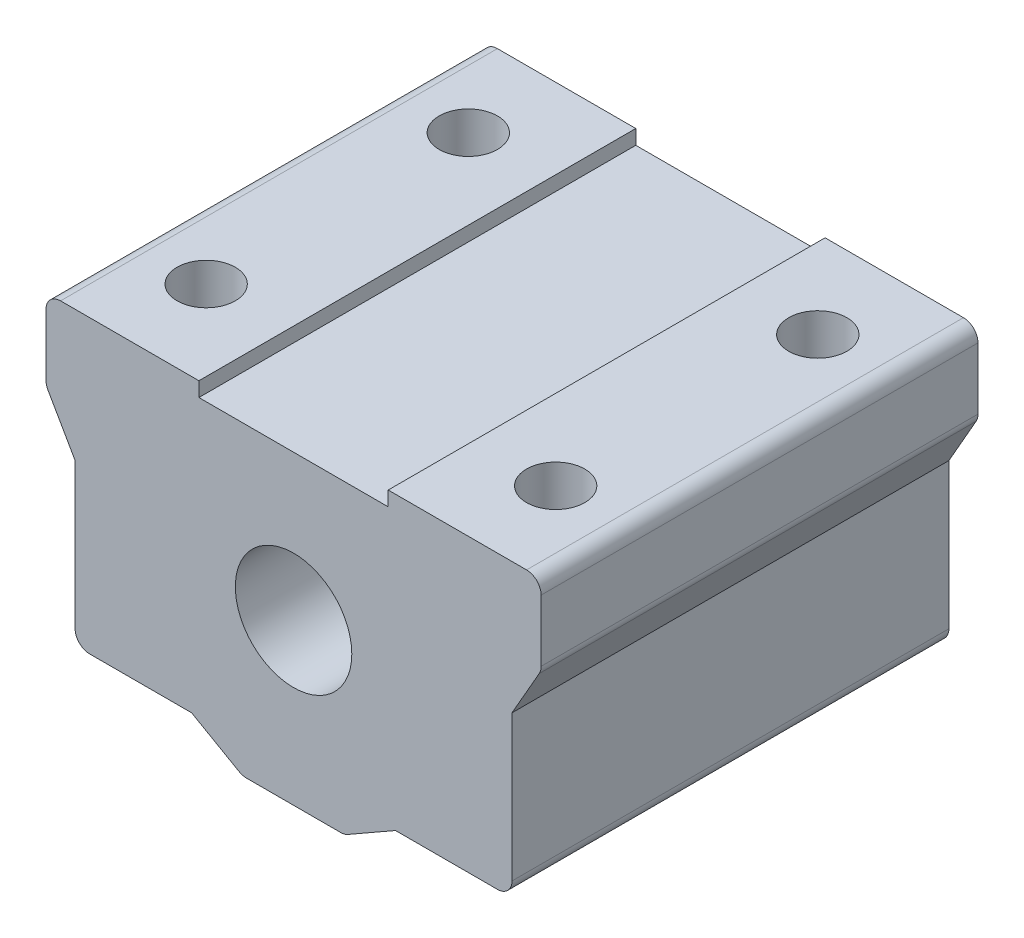
ISO-10303-21;
HEADER;
FILE_DESCRIPTION(('STEP AP214'),'2;1');
FILE_NAME('part.step','',(''),(''),'','','');
FILE_SCHEMA(('AUTOMOTIVE_DESIGN { 1 0 10303 214 1 1 1 1 }'));
ENDSEC;
DATA;
#1=APPLICATION_CONTEXT('core data for automotive mechanical design processes');
#2=APPLICATION_PROTOCOL_DEFINITION('international standard','automotive_design',2000,#1);
#3=PRODUCT_CONTEXT('',#1,'mechanical');
#4=PRODUCT('Part','Part','',(#3));
#5=PRODUCT_RELATED_PRODUCT_CATEGORY('part','',(#4));
#6=PRODUCT_DEFINITION_FORMATION('','',#4);
#7=PRODUCT_DEFINITION_CONTEXT('part definition',#1,'design');
#8=PRODUCT_DEFINITION('design','',#6,#7);
#9=PRODUCT_DEFINITION_SHAPE('','',#8);
#10=(LENGTH_UNIT() NAMED_UNIT(*) SI_UNIT(.MILLI.,.METRE.));
#11=(NAMED_UNIT(*) PLANE_ANGLE_UNIT() SI_UNIT($,.RADIAN.));
#12=(NAMED_UNIT(*) SI_UNIT($,.STERADIAN.) SOLID_ANGLE_UNIT());
#13=UNCERTAINTY_MEASURE_WITH_UNIT(LENGTH_MEASURE(1.E-05),#10,'distance_accuracy_value','');
#14=(GEOMETRIC_REPRESENTATION_CONTEXT(3) GLOBAL_UNCERTAINTY_ASSIGNED_CONTEXT((#13)) GLOBAL_UNIT_ASSIGNED_CONTEXT((#10,
#11,#12)) REPRESENTATION_CONTEXT('',''));
#15=CARTESIAN_POINT('',(0.,0.,0.));
#16=DIRECTION('',(0.,0.,1.));
#17=DIRECTION('',(1.,0.,0.));
#18=AXIS2_PLACEMENT_3D('',#15,#16,#17);
#19=CARTESIAN_POINT('',(-17.,0.,30.));
#20=DIRECTION('',(0.,-1.,0.));
#21=DIRECTION('',(1.,0.,0.));
#22=AXIS2_PLACEMENT_3D('',#19,#20,#21);
#23=PLANE('',#22);
#24=CARTESIAN_POINT('',(-12.,0.,6.));
#25=DIRECTION('',(0.,1.,0.));
#26=DIRECTION('',(-1.,0.,0.));
#27=AXIS2_PLACEMENT_3D('',#24,#25,#26);
#28=CIRCLE('',#27,2.);
#29=CARTESIAN_POINT('',(-14.,0.,6.));
#30=VERTEX_POINT('',#29);
#31=EDGE_CURVE('E242',#30,#30,#28,.T.);
#32=ORIENTED_EDGE('',*,*,#31,.F.);
#33=EDGE_LOOP('',(#32));
#34=FACE_BOUND('',#33,.T.);
#35=CARTESIAN_POINT('',(-12.,0.,24.));
#36=DIRECTION('',(0.,1.,0.));
#37=DIRECTION('',(-1.,0.,0.));
#38=AXIS2_PLACEMENT_3D('',#35,#36,#37);
#39=CIRCLE('',#38,2.);
#40=CARTESIAN_POINT('',(-14.,0.,24.));
#41=VERTEX_POINT('',#40);
#42=EDGE_CURVE('E237',#41,#41,#39,.T.);
#43=ORIENTED_EDGE('',*,*,#42,.F.);
#44=EDGE_LOOP('',(#43));
#45=FACE_BOUND('',#44,.T.);
#46=DIRECTION('',(-1.,0.,0.));
#47=VECTOR('',#46,1.);
#48=CARTESIAN_POINT('',(-17.,0.,30.));
#49=LINE('',#48,#47);
#50=CARTESIAN_POINT('',(-6.5,0.,30.));
#51=VERTEX_POINT('',#50);
#52=CARTESIAN_POINT('',(-16.,0.,30.));
#53=VERTEX_POINT('',#52);
#54=EDGE_CURVE('E293',#51,#53,#49,.T.);
#55=ORIENTED_EDGE('',*,*,#54,.F.);
#56=DIRECTION('',(0.,0.,1.));
#57=VECTOR('',#56,1.);
#58=CARTESIAN_POINT('',(-6.5,0.,0.));
#59=LINE('',#58,#57);
#60=CARTESIAN_POINT('',(-6.5,0.,0.));
#61=VERTEX_POINT('',#60);
#62=EDGE_CURVE('E208',#61,#51,#59,.T.);
#63=ORIENTED_EDGE('',*,*,#62,.F.);
#64=DIRECTION('',(-1.,0.,0.));
#65=VECTOR('',#64,1.);
#66=CARTESIAN_POINT('',(-17.,0.,0.));
#67=LINE('',#66,#65);
#68=CARTESIAN_POINT('',(-16.,0.,0.));
#69=VERTEX_POINT('',#68);
#70=EDGE_CURVE('E325',#61,#69,#67,.T.);
#71=ORIENTED_EDGE('',*,*,#70,.T.);
#72=DIRECTION('',(0.,0.,-1.));
#73=VECTOR('',#72,1.);
#74=CARTESIAN_POINT('',(-16.,0.,30.));
#75=LINE('',#74,#73);
#76=EDGE_CURVE('E395',#69,#53,#75,.F.);
#77=ORIENTED_EDGE('',*,*,#76,.T.);
#78=EDGE_LOOP('',(#55,#63,#71,#77));
#79=FACE_BOUND('',#78,.T.);
#80=ADVANCED_FACE('F32',(#34,#45,#79),#23,.F.);
#81=CARTESIAN_POINT('',(-17.,-5.5,30.));
#82=DIRECTION('',(1.,0.,0.));
#83=DIRECTION('',(0.,1.,0.));
#84=AXIS2_PLACEMENT_3D('',#81,#82,#83);
#85=PLANE('',#84);
#86=DIRECTION('',(0.,-1.,0.));
#87=VECTOR('',#86,1.);
#88=CARTESIAN_POINT('',(-17.,-5.5,0.));
#89=LINE('',#88,#87);
#90=CARTESIAN_POINT('',(-17.,-0.999999999999999,0.));
#91=VERTEX_POINT('',#90);
#92=CARTESIAN_POINT('',(-17.,-5.23443556292536,0.));
#93=VERTEX_POINT('',#92);
#94=EDGE_CURVE('E260',#91,#93,#89,.T.);
#95=ORIENTED_EDGE('',*,*,#94,.T.);
#96=DIRECTION('',(0.,0.,-1.));
#97=VECTOR('',#96,1.);
#98=CARTESIAN_POINT('',(-17.,-5.23443556292536,30.));
#99=LINE('',#98,#97);
#100=CARTESIAN_POINT('',(-17.,-5.23443556292536,30.));
#101=VERTEX_POINT('',#100);
#102=EDGE_CURVE('E11',#93,#101,#99,.F.);
#103=ORIENTED_EDGE('',*,*,#102,.T.);
#104=DIRECTION('',(0.,-1.,0.));
#105=VECTOR('',#104,1.);
#106=CARTESIAN_POINT('',(-17.,-5.5,30.));
#107=LINE('',#106,#105);
#108=CARTESIAN_POINT('',(-17.,-0.999999999999999,30.));
#109=VERTEX_POINT('',#108);
#110=EDGE_CURVE('E263',#109,#101,#107,.T.);
#111=ORIENTED_EDGE('',*,*,#110,.F.);
#112=DIRECTION('',(0.,0.,-1.));
#113=VECTOR('',#112,1.);
#114=CARTESIAN_POINT('',(-17.,-0.999999999999999,30.));
#115=LINE('',#114,#113);
#116=EDGE_CURVE('E40',#109,#91,#115,.T.);
#117=ORIENTED_EDGE('',*,*,#116,.T.);
#118=EDGE_LOOP('',(#95,#103,#111,#117));
#119=FACE_BOUND('',#118,.T.);
#120=ADVANCED_FACE('F417',(#119),#85,.F.);
#121=CARTESIAN_POINT('',(-15.,-9.,30.));
#122=DIRECTION('',(0.868243142124459,0.496138938356834,0.));
#123=DIRECTION('',(-0.496138938356834,0.868243142124459,0.));
#124=AXIS2_PLACEMENT_3D('',#121,#122,#123);
#125=PLANE('',#124);
#126=DIRECTION('',(0.496138938356834,-0.868243142124459,0.));
#127=VECTOR('',#126,1.);
#128=CARTESIAN_POINT('',(-15.,-9.,30.));
#129=LINE('',#128,#127);
#130=CARTESIAN_POINT('',(-16.8682431421245,-5.7305745012822,30.));
#131=VERTEX_POINT('',#130);
#132=CARTESIAN_POINT('',(-15.,-9.,30.));
#133=VERTEX_POINT('',#132);
#134=EDGE_CURVE('E266',#131,#133,#129,.T.);
#135=ORIENTED_EDGE('',*,*,#134,.F.);
#136=DIRECTION('',(0.,0.,-1.));
#137=VECTOR('',#136,1.);
#138=CARTESIAN_POINT('',(-16.8682431421245,-5.7305745012822,30.));
#139=LINE('',#138,#137);
#140=CARTESIAN_POINT('',(-16.8682431421245,-5.7305745012822,0.));
#141=VERTEX_POINT('',#140);
#142=EDGE_CURVE('E410',#131,#141,#139,.T.);
#143=ORIENTED_EDGE('',*,*,#142,.T.);
#144=DIRECTION('',(0.496138938356834,-0.868243142124459,0.));
#145=VECTOR('',#144,1.);
#146=CARTESIAN_POINT('',(-15.,-9.,0.));
#147=LINE('',#146,#145);
#148=CARTESIAN_POINT('',(-15.,-9.,0.));
#149=VERTEX_POINT('',#148);
#150=EDGE_CURVE('E299',#141,#149,#147,.T.);
#151=ORIENTED_EDGE('',*,*,#150,.T.);
#152=DIRECTION('',(0.,0.,-1.));
#153=VECTOR('',#152,1.);
#154=CARTESIAN_POINT('',(-15.,-9.,30.));
#155=LINE('',#154,#153);
#156=EDGE_CURVE('E336',#133,#149,#155,.T.);
#157=ORIENTED_EDGE('',*,*,#156,.F.);
#158=EDGE_LOOP('',(#135,#143,#151,#157));
#159=FACE_BOUND('',#158,.T.);
#160=ADVANCED_FACE('F434',(#159),#125,.F.);
#161=CARTESIAN_POINT('',(-15.,-20.,30.));
#162=DIRECTION('',(1.,0.,0.));
#163=DIRECTION('',(0.,0.,-1.));
#164=AXIS2_PLACEMENT_3D('',#161,#162,#163);
#165=PLANE('',#164);
#166=DIRECTION('',(0.,-1.,0.));
#167=VECTOR('',#166,1.);
#168=CARTESIAN_POINT('',(-15.,-20.,0.));
#169=LINE('',#168,#167);
#170=CARTESIAN_POINT('',(-15.,-19.,0.));
#171=VERTEX_POINT('',#170);
#172=EDGE_CURVE('E301',#149,#171,#169,.T.);
#173=ORIENTED_EDGE('',*,*,#172,.T.);
#174=DIRECTION('',(0.,0.,-1.));
#175=VECTOR('',#174,1.);
#176=CARTESIAN_POINT('',(-15.,-19.,30.));
#177=LINE('',#176,#175);
#178=CARTESIAN_POINT('',(-15.,-19.,30.));
#179=VERTEX_POINT('',#178);
#180=EDGE_CURVE('E407',#171,#179,#177,.F.);
#181=ORIENTED_EDGE('',*,*,#180,.T.);
#182=DIRECTION('',(0.,-1.,0.));
#183=VECTOR('',#182,1.);
#184=CARTESIAN_POINT('',(-15.,-20.,30.));
#185=LINE('',#184,#183);
#186=EDGE_CURVE('E269',#133,#179,#185,.T.);
#187=ORIENTED_EDGE('',*,*,#186,.F.);
#188=ORIENTED_EDGE('',*,*,#156,.T.);
#189=EDGE_LOOP('',(#173,#181,#187,#188));
#190=FACE_BOUND('',#189,.T.);
#191=ADVANCED_FACE('F729',(#190),#165,.F.);
#192=CARTESIAN_POINT('',(-7.,-20.,30.));
#193=DIRECTION('',(0.,1.,0.));
#194=DIRECTION('',(0.,0.,1.));
#195=AXIS2_PLACEMENT_3D('',#192,#193,#194);
#196=PLANE('',#195);
#197=DIRECTION('',(0.,0.,-1.));
#198=VECTOR('',#197,1.);
#199=CARTESIAN_POINT('',(-14.,-20.,30.));
#200=LINE('',#199,#198);
#201=CARTESIAN_POINT('',(-14.,-20.,30.));
#202=VERTEX_POINT('',#201);
#203=CARTESIAN_POINT('',(-14.,-20.,24.));
#204=VERTEX_POINT('',#203);
#205=EDGE_CURVE('E404',#202,#204,#200,.T.);
#206=ORIENTED_EDGE('',*,*,#205,.T.);
#207=CARTESIAN_POINT('',(-12.,-20.,24.));
#208=DIRECTION('',(0.,1.,0.));
#209=DIRECTION('',(0.,0.,1.));
#210=AXIS2_PLACEMENT_3D('',#207,#208,#209);
#211=CIRCLE('',#210,2.);
#212=EDGE_CURVE('E240',#204,#204,#211,.F.);
#213=ORIENTED_EDGE('',*,*,#212,.F.);
#214=CARTESIAN_POINT('',(-14.,-20.,6.));
#215=VERTEX_POINT('',#214);
#216=EDGE_CURVE('E408',#204,#215,#200,.T.);
#217=ORIENTED_EDGE('',*,*,#216,.T.);
#218=CARTESIAN_POINT('',(-12.,-20.,6.));
#219=DIRECTION('',(0.,1.,0.));
#220=DIRECTION('',(0.,0.,1.));
#221=AXIS2_PLACEMENT_3D('',#218,#219,#220);
#222=CIRCLE('',#221,2.);
#223=EDGE_CURVE('E253',#215,#215,#222,.F.);
#224=ORIENTED_EDGE('',*,*,#223,.F.);
#225=CARTESIAN_POINT('',(-14.,-20.,0.));
#226=VERTEX_POINT('',#225);
#227=EDGE_CURVE('E403',#215,#226,#200,.T.);
#228=ORIENTED_EDGE('',*,*,#227,.T.);
#229=DIRECTION('',(1.,0.,0.));
#230=VECTOR('',#229,1.);
#231=CARTESIAN_POINT('',(-7.,-20.,0.));
#232=LINE('',#231,#230);
#233=CARTESIAN_POINT('',(-7.,-20.,0.));
#234=VERTEX_POINT('',#233);
#235=EDGE_CURVE('E304',#226,#234,#232,.T.);
#236=ORIENTED_EDGE('',*,*,#235,.T.);
#237=DIRECTION('',(0.,0.,-1.));
#238=VECTOR('',#237,1.);
#239=CARTESIAN_POINT('',(-7.,-20.,30.));
#240=LINE('',#239,#238);
#241=CARTESIAN_POINT('',(-7.,-20.,30.));
#242=VERTEX_POINT('',#241);
#243=EDGE_CURVE('E333',#242,#234,#240,.T.);
#244=ORIENTED_EDGE('',*,*,#243,.F.);
#245=DIRECTION('',(1.,0.,0.));
#246=VECTOR('',#245,1.);
#247=CARTESIAN_POINT('',(-7.,-20.,30.));
#248=LINE('',#247,#246);
#249=EDGE_CURVE('E272',#202,#242,#248,.T.);
#250=ORIENTED_EDGE('',*,*,#249,.F.);
#251=EDGE_LOOP('',(#206,#213,#217,#224,#228,#236,#244,#250));
#252=FACE_BOUND('',#251,.T.);
#253=ADVANCED_FACE('F721',(#252),#196,.F.);
#254=CARTESIAN_POINT('',(-3.5,-22.,30.));
#255=DIRECTION('',(0.496138938356834,0.868243142124459,0.));
#256=DIRECTION('',(-0.868243142124459,0.496138938356834,0.));
#257=AXIS2_PLACEMENT_3D('',#254,#255,#256);
#258=PLANE('',#257);
#259=DIRECTION('',(0.868243142124459,-0.496138938356834,0.));
#260=VECTOR('',#259,1.);
#261=CARTESIAN_POINT('',(-3.5,-22.,0.));
#262=LINE('',#261,#260);
#263=CARTESIAN_POINT('',(-3.7305745012822,-21.8682431421245,0.));
#264=VERTEX_POINT('',#263);
#265=EDGE_CURVE('E306',#234,#264,#262,.T.);
#266=ORIENTED_EDGE('',*,*,#265,.T.);
#267=DIRECTION('',(0.,0.,-1.));
#268=VECTOR('',#267,1.);
#269=CARTESIAN_POINT('',(-3.7305745012822,-21.8682431421245,30.));
#270=LINE('',#269,#268);
#271=CARTESIAN_POINT('',(-3.7305745012822,-21.8682431421245,30.));
#272=VERTEX_POINT('',#271);
#273=EDGE_CURVE('E401',#264,#272,#270,.F.);
#274=ORIENTED_EDGE('',*,*,#273,.T.);
#275=DIRECTION('',(0.868243142124459,-0.496138938356834,0.));
#276=VECTOR('',#275,1.);
#277=CARTESIAN_POINT('',(-3.5,-22.,30.));
#278=LINE('',#277,#276);
#279=EDGE_CURVE('E274',#242,#272,#278,.T.);
#280=ORIENTED_EDGE('',*,*,#279,.F.);
#281=ORIENTED_EDGE('',*,*,#243,.T.);
#282=EDGE_LOOP('',(#266,#274,#280,#281));
#283=FACE_BOUND('',#282,.T.);
#284=ADVANCED_FACE('F712',(#283),#258,.F.);
#285=CARTESIAN_POINT('',(3.5,-22.,30.));
#286=DIRECTION('',(0.,1.,0.));
#287=DIRECTION('',(0.,0.,1.));
#288=AXIS2_PLACEMENT_3D('',#285,#286,#287);
#289=PLANE('',#288);
#290=DIRECTION('',(1.,0.,0.));
#291=VECTOR('',#290,1.);
#292=CARTESIAN_POINT('',(3.5,-22.,0.));
#293=LINE('',#292,#291);
#294=CARTESIAN_POINT('',(-3.23443556292536,-22.,0.));
#295=VERTEX_POINT('',#294);
#296=CARTESIAN_POINT('',(3.23443556292536,-22.,0.));
#297=VERTEX_POINT('',#296);
#298=EDGE_CURVE('E309',#295,#297,#293,.T.);
#299=ORIENTED_EDGE('',*,*,#298,.T.);
#300=DIRECTION('',(0.,0.,-1.));
#301=VECTOR('',#300,1.);
#302=CARTESIAN_POINT('',(3.23443556292536,-22.,30.));
#303=LINE('',#302,#301);
#304=CARTESIAN_POINT('',(3.23443556292536,-22.,30.));
#305=VERTEX_POINT('',#304);
#306=EDGE_CURVE('E362',#297,#305,#303,.F.);
#307=ORIENTED_EDGE('',*,*,#306,.T.);
#308=DIRECTION('',(1.,0.,0.));
#309=VECTOR('',#308,1.);
#310=CARTESIAN_POINT('',(3.5,-22.,30.));
#311=LINE('',#310,#309);
#312=CARTESIAN_POINT('',(-3.23443556292536,-22.,30.));
#313=VERTEX_POINT('',#312);
#314=EDGE_CURVE('E277',#313,#305,#311,.T.);
#315=ORIENTED_EDGE('',*,*,#314,.F.);
#316=DIRECTION('',(0.,0.,-1.));
#317=VECTOR('',#316,1.);
#318=CARTESIAN_POINT('',(-3.23443556292536,-22.,30.));
#319=LINE('',#318,#317);
#320=EDGE_CURVE('E359',#313,#295,#319,.T.);
#321=ORIENTED_EDGE('',*,*,#320,.T.);
#322=EDGE_LOOP('',(#299,#307,#315,#321));
#323=FACE_BOUND('',#322,.T.);
#324=ADVANCED_FACE('F492',(#323),#289,.F.);
#325=CARTESIAN_POINT('',(7.,-20.,30.));
#326=DIRECTION('',(-0.496138938356834,0.868243142124459,0.));
#327=DIRECTION('',(-0.868243142124459,-0.496138938356834,0.));
#328=AXIS2_PLACEMENT_3D('',#325,#326,#327);
#329=PLANE('',#328);
#330=DIRECTION('',(0.868243142124459,0.496138938356834,0.));
#331=VECTOR('',#330,1.);
#332=CARTESIAN_POINT('',(7.,-20.,30.));
#333=LINE('',#332,#331);
#334=CARTESIAN_POINT('',(3.7305745012822,-21.8682431421245,30.));
#335=VERTEX_POINT('',#334);
#336=CARTESIAN_POINT('',(7.,-20.,30.));
#337=VERTEX_POINT('',#336);
#338=EDGE_CURVE('E280',#335,#337,#333,.T.);
#339=ORIENTED_EDGE('',*,*,#338,.F.);
#340=DIRECTION('',(0.,0.,-1.));
#341=VECTOR('',#340,1.);
#342=CARTESIAN_POINT('',(3.7305745012822,-21.8682431421245,30.));
#343=LINE('',#342,#341);
#344=CARTESIAN_POINT('',(3.7305745012822,-21.8682431421245,0.));
#345=VERTEX_POINT('',#344);
#346=EDGE_CURVE('E339',#335,#345,#343,.T.);
#347=ORIENTED_EDGE('',*,*,#346,.T.);
#348=DIRECTION('',(0.868243142124459,0.496138938356834,0.));
#349=VECTOR('',#348,1.);
#350=CARTESIAN_POINT('',(7.,-20.,0.));
#351=LINE('',#350,#349);
#352=CARTESIAN_POINT('',(7.,-20.,0.));
#353=VERTEX_POINT('',#352);
#354=EDGE_CURVE('E312',#345,#353,#351,.T.);
#355=ORIENTED_EDGE('',*,*,#354,.T.);
#356=DIRECTION('',(0.,0.,-1.));
#357=VECTOR('',#356,1.);
#358=CARTESIAN_POINT('',(7.,-20.,30.));
#359=LINE('',#358,#357);
#360=EDGE_CURVE('E330',#337,#353,#359,.T.);
#361=ORIENTED_EDGE('',*,*,#360,.F.);
#362=EDGE_LOOP('',(#339,#347,#355,#361));
#363=FACE_BOUND('',#362,.T.);
#364=ADVANCED_FACE('F487',(#363),#329,.F.);
#365=CARTESIAN_POINT('',(15.,-20.,30.));
#366=DIRECTION('',(0.,1.,0.));
#367=DIRECTION('',(0.,0.,1.));
#368=AXIS2_PLACEMENT_3D('',#365,#366,#367);
#369=PLANE('',#368);
#370=DIRECTION('',(0.,0.,-1.));
#371=VECTOR('',#370,1.);
#372=CARTESIAN_POINT('',(14.,-20.,30.));
#373=LINE('',#372,#371);
#374=CARTESIAN_POINT('',(14.,-20.,6.));
#375=VERTEX_POINT('',#374);
#376=CARTESIAN_POINT('',(14.,-20.,24.));
#377=VERTEX_POINT('',#376);
#378=EDGE_CURVE('E388',#375,#377,#373,.F.);
#379=ORIENTED_EDGE('',*,*,#378,.T.);
#380=CARTESIAN_POINT('',(12.,-20.,24.));
#381=DIRECTION('',(0.,1.,0.));
#382=DIRECTION('',(0.,0.,1.));
#383=AXIS2_PLACEMENT_3D('',#380,#381,#382);
#384=CIRCLE('',#383,2.);
#385=EDGE_CURVE('E53',#377,#377,#384,.F.);
#386=ORIENTED_EDGE('',*,*,#385,.F.);
#387=CARTESIAN_POINT('',(14.,-20.,30.));
#388=VERTEX_POINT('',#387);
#389=EDGE_CURVE('E383',#377,#388,#373,.F.);
#390=ORIENTED_EDGE('',*,*,#389,.T.);
#391=DIRECTION('',(1.,0.,0.));
#392=VECTOR('',#391,1.);
#393=CARTESIAN_POINT('',(15.,-20.,30.));
#394=LINE('',#393,#392);
#395=EDGE_CURVE('E282',#337,#388,#394,.T.);
#396=ORIENTED_EDGE('',*,*,#395,.F.);
#397=ORIENTED_EDGE('',*,*,#360,.T.);
#398=DIRECTION('',(1.,0.,0.));
#399=VECTOR('',#398,1.);
#400=CARTESIAN_POINT('',(15.,-20.,0.));
#401=LINE('',#400,#399);
#402=CARTESIAN_POINT('',(14.,-20.,0.));
#403=VERTEX_POINT('',#402);
#404=EDGE_CURVE('E314',#353,#403,#401,.T.);
#405=ORIENTED_EDGE('',*,*,#404,.T.);
#406=EDGE_CURVE('E384',#403,#375,#373,.F.);
#407=ORIENTED_EDGE('',*,*,#406,.T.);
#408=CARTESIAN_POINT('',(12.,-20.,6.));
#409=DIRECTION('',(0.,1.,0.));
#410=DIRECTION('',(0.,0.,1.));
#411=AXIS2_PLACEMENT_3D('',#408,#409,#410);
#412=CIRCLE('',#411,2.);
#413=EDGE_CURVE('E246',#375,#375,#412,.F.);
#414=ORIENTED_EDGE('',*,*,#413,.F.);
#415=EDGE_LOOP('',(#379,#386,#390,#396,#397,#405,#407,#414));
#416=FACE_BOUND('',#415,.T.);
#417=ADVANCED_FACE('F475',(#416),#369,.F.);
#418=CARTESIAN_POINT('',(15.,-9.,30.));
#419=DIRECTION('',(-1.,0.,0.));
#420=DIRECTION('',(0.,0.,1.));
#421=AXIS2_PLACEMENT_3D('',#418,#419,#420);
#422=PLANE('',#421);
#423=DIRECTION('',(0.,1.,0.));
#424=VECTOR('',#423,1.);
#425=CARTESIAN_POINT('',(15.,-9.,30.));
#426=LINE('',#425,#424);
#427=CARTESIAN_POINT('',(15.,-19.,30.));
#428=VERTEX_POINT('',#427);
#429=CARTESIAN_POINT('',(15.,-9.,30.));
#430=VERTEX_POINT('',#429);
#431=EDGE_CURVE('E285',#428,#430,#426,.T.);
#432=ORIENTED_EDGE('',*,*,#431,.F.);
#433=DIRECTION('',(0.,0.,-1.));
#434=VECTOR('',#433,1.);
#435=CARTESIAN_POINT('',(15.,-19.,30.));
#436=LINE('',#435,#434);
#437=CARTESIAN_POINT('',(15.,-19.,0.));
#438=VERTEX_POINT('',#437);
#439=EDGE_CURVE('E380',#428,#438,#436,.T.);
#440=ORIENTED_EDGE('',*,*,#439,.T.);
#441=DIRECTION('',(0.,1.,0.));
#442=VECTOR('',#441,1.);
#443=CARTESIAN_POINT('',(15.,-9.,0.));
#444=LINE('',#443,#442);
#445=CARTESIAN_POINT('',(15.,-9.,0.));
#446=VERTEX_POINT('',#445);
#447=EDGE_CURVE('E317',#438,#446,#444,.T.);
#448=ORIENTED_EDGE('',*,*,#447,.T.);
#449=DIRECTION('',(0.,0.,-1.));
#450=VECTOR('',#449,1.);
#451=CARTESIAN_POINT('',(15.,-9.,30.));
#452=LINE('',#451,#450);
#453=EDGE_CURVE('E296',#430,#446,#452,.T.);
#454=ORIENTED_EDGE('',*,*,#453,.F.);
#455=EDGE_LOOP('',(#432,#440,#448,#454));
#456=FACE_BOUND('',#455,.T.);
#457=ADVANCED_FACE('F467',(#456),#422,.F.);
#458=CARTESIAN_POINT('',(17.,-5.5,30.));
#459=DIRECTION('',(-0.868243142124459,0.496138938356835,0.));
#460=DIRECTION('',(-0.496138938356835,-0.868243142124458,0.));
#461=AXIS2_PLACEMENT_3D('',#458,#459,#460);
#462=PLANE('',#461);
#463=DIRECTION('',(0.496138938356835,0.868243142124458,0.));
#464=VECTOR('',#463,1.);
#465=CARTESIAN_POINT('',(17.,-5.5,0.));
#466=LINE('',#465,#464);
#467=CARTESIAN_POINT('',(16.8682431421245,-5.73057450128219,0.));
#468=VERTEX_POINT('',#467);
#469=EDGE_CURVE('E319',#446,#468,#466,.T.);
#470=ORIENTED_EDGE('',*,*,#469,.T.);
#471=DIRECTION('',(0.,0.,-1.));
#472=VECTOR('',#471,1.);
#473=CARTESIAN_POINT('',(16.8682431421245,-5.73057450128219,30.));
#474=LINE('',#473,#472);
#475=CARTESIAN_POINT('',(16.8682431421245,-5.73057450128219,30.));
#476=VERTEX_POINT('',#475);
#477=EDGE_CURVE('E393',#468,#476,#474,.F.);
#478=ORIENTED_EDGE('',*,*,#477,.T.);
#479=DIRECTION('',(0.496138938356835,0.868243142124458,0.));
#480=VECTOR('',#479,1.);
#481=CARTESIAN_POINT('',(17.,-5.5,30.));
#482=LINE('',#481,#480);
#483=EDGE_CURVE('E287',#430,#476,#482,.T.);
#484=ORIENTED_EDGE('',*,*,#483,.F.);
#485=ORIENTED_EDGE('',*,*,#453,.T.);
#486=EDGE_LOOP('',(#470,#478,#484,#485));
#487=FACE_BOUND('',#486,.T.);
#488=ADVANCED_FACE('F462',(#487),#462,.F.);
#489=CARTESIAN_POINT('',(17.,0.,30.));
#490=DIRECTION('',(-1.,0.,0.));
#491=DIRECTION('',(0.,-1.,0.));
#492=AXIS2_PLACEMENT_3D('',#489,#490,#491);
#493=PLANE('',#492);
#494=DIRECTION('',(0.,1.,0.));
#495=VECTOR('',#494,1.);
#496=CARTESIAN_POINT('',(17.,0.,30.));
#497=LINE('',#496,#495);
#498=CARTESIAN_POINT('',(17.,-5.23443556292536,30.));
#499=VERTEX_POINT('',#498);
#500=CARTESIAN_POINT('',(17.,-0.999999999999994,30.));
#501=VERTEX_POINT('',#500);
#502=EDGE_CURVE('E290',#499,#501,#497,.T.);
#503=ORIENTED_EDGE('',*,*,#502,.F.);
#504=DIRECTION('',(0.,0.,-1.));
#505=VECTOR('',#504,1.);
#506=CARTESIAN_POINT('',(17.,-5.23443556292536,30.));
#507=LINE('',#506,#505);
#508=CARTESIAN_POINT('',(17.,-5.23443556292536,0.));
#509=VERTEX_POINT('',#508);
#510=EDGE_CURVE('E390',#499,#509,#507,.T.);
#511=ORIENTED_EDGE('',*,*,#510,.T.);
#512=DIRECTION('',(0.,1.,0.));
#513=VECTOR('',#512,1.);
#514=CARTESIAN_POINT('',(17.,0.,0.));
#515=LINE('',#514,#513);
#516=CARTESIAN_POINT('',(17.,-0.999999999999994,0.));
#517=VERTEX_POINT('',#516);
#518=EDGE_CURVE('E322',#509,#517,#515,.T.);
#519=ORIENTED_EDGE('',*,*,#518,.T.);
#520=DIRECTION('',(0.,0.,-1.));
#521=VECTOR('',#520,1.);
#522=CARTESIAN_POINT('',(17.,-0.999999999999994,30.));
#523=LINE('',#522,#521);
#524=EDGE_CURVE('E387',#517,#501,#523,.F.);
#525=ORIENTED_EDGE('',*,*,#524,.T.);
#526=EDGE_LOOP('',(#503,#511,#519,#525));
#527=FACE_BOUND('',#526,.T.);
#528=ADVANCED_FACE('F453',(#527),#493,.F.);
#529=CARTESIAN_POINT('',(12.,0.,24.));
#530=DIRECTION('',(0.,1.,0.));
#531=DIRECTION('',(-1.,0.,0.));
#532=AXIS2_PLACEMENT_3D('',#529,#530,#531);
#533=CIRCLE('',#532,2.);
#534=CARTESIAN_POINT('',(10.,0.,24.));
#535=VERTEX_POINT('',#534);
#536=EDGE_CURVE('E243',#535,#535,#533,.T.);
#537=ORIENTED_EDGE('',*,*,#536,.F.);
#538=EDGE_LOOP('',(#537));
#539=FACE_BOUND('',#538,.T.);
#540=CARTESIAN_POINT('',(12.,0.,6.));
#541=DIRECTION('',(0.,1.,0.));
#542=DIRECTION('',(-1.,0.,0.));
#543=AXIS2_PLACEMENT_3D('',#540,#541,#542);
#544=CIRCLE('',#543,2.);
#545=CARTESIAN_POINT('',(10.,0.,6.));
#546=VERTEX_POINT('',#545);
#547=EDGE_CURVE('E232',#546,#546,#544,.T.);
#548=ORIENTED_EDGE('',*,*,#547,.F.);
#549=EDGE_LOOP('',(#548));
#550=FACE_BOUND('',#549,.T.);
#551=CARTESIAN_POINT('',(16.,0.,0.));
#552=VERTEX_POINT('',#551);
#553=CARTESIAN_POINT('',(6.5,0.,0.));
#554=VERTEX_POINT('',#553);
#555=EDGE_CURVE('E267',#552,#554,#67,.T.);
#556=ORIENTED_EDGE('',*,*,#555,.T.);
#557=DIRECTION('',(0.,0.,-1.));
#558=VECTOR('',#557,1.);
#559=CARTESIAN_POINT('',(6.5,0.,0.));
#560=LINE('',#559,#558);
#561=CARTESIAN_POINT('',(6.5,0.,30.));
#562=VERTEX_POINT('',#561);
#563=EDGE_CURVE('E220',#562,#554,#560,.T.);
#564=ORIENTED_EDGE('',*,*,#563,.F.);
#565=CARTESIAN_POINT('',(16.,0.,30.));
#566=VERTEX_POINT('',#565);
#567=EDGE_CURVE('E294',#566,#562,#49,.T.);
#568=ORIENTED_EDGE('',*,*,#567,.F.);
#569=DIRECTION('',(0.,0.,-1.));
#570=VECTOR('',#569,1.);
#571=CARTESIAN_POINT('',(16.,0.,30.));
#572=LINE('',#571,#570);
#573=EDGE_CURVE('E398',#566,#552,#572,.T.);
#574=ORIENTED_EDGE('',*,*,#573,.T.);
#575=EDGE_LOOP('',(#556,#564,#568,#574));
#576=FACE_BOUND('',#575,.T.);
#577=ADVANCED_FACE('F443',(#539,#550,#576),#23,.F.);
#578=CARTESIAN_POINT('',(0.,0.,30.));
#579=DIRECTION('',(0.,0.,-1.));
#580=DIRECTION('',(-1.,0.,0.));
#581=AXIS2_PLACEMENT_3D('',#578,#579,#580);
#582=PLANE('',#581);
#583=CARTESIAN_POINT('',(0.,-11.,30.));
#584=DIRECTION('',(0.,0.,1.));
#585=DIRECTION('',(1.,0.,0.));
#586=AXIS2_PLACEMENT_3D('',#583,#584,#585);
#587=CIRCLE('',#586,4.);
#588=CARTESIAN_POINT('',(4.,-11.,30.));
#589=VERTEX_POINT('',#588);
#590=EDGE_CURVE('E257',#589,#589,#587,.T.);
#591=ORIENTED_EDGE('',*,*,#590,.F.);
#592=EDGE_LOOP('',(#591));
#593=FACE_BOUND('',#592,.T.);
#594=DIRECTION('',(1.,0.,0.));
#595=VECTOR('',#594,1.);
#596=CARTESIAN_POINT('',(-6.5,-1.,30.));
#597=LINE('',#596,#595);
#598=CARTESIAN_POINT('',(-6.5,-1.,30.));
#599=VERTEX_POINT('',#598);
#600=CARTESIAN_POINT('',(6.5,-0.999999999999999,30.));
#601=VERTEX_POINT('',#600);
#602=EDGE_CURVE('E216',#599,#601,#597,.T.);
#603=ORIENTED_EDGE('',*,*,#602,.F.);
#604=DIRECTION('',(0.,1.,0.));
#605=VECTOR('',#604,1.);
#606=CARTESIAN_POINT('',(-6.5,-1.,30.));
#607=LINE('',#606,#605);
#608=EDGE_CURVE('E203',#599,#51,#607,.T.);
#609=ORIENTED_EDGE('',*,*,#608,.T.);
#610=ORIENTED_EDGE('',*,*,#54,.T.);
#611=CARTESIAN_POINT('',(-16.,-1.,30.));
#612=DIRECTION('',(0.,0.,-1.));
#613=DIRECTION('',(-1.,0.,0.));
#614=AXIS2_PLACEMENT_3D('',#611,#612,#613);
#615=CIRCLE('',#614,1.);
#616=EDGE_CURVE('E364',#53,#109,#615,.F.);
#617=ORIENTED_EDGE('',*,*,#616,.T.);
#618=ORIENTED_EDGE('',*,*,#110,.T.);
#619=CARTESIAN_POINT('',(-16.,-5.23443556292536,30.));
#620=DIRECTION('',(0.,0.,-1.));
#621=DIRECTION('',(-1.,0.,0.));
#622=AXIS2_PLACEMENT_3D('',#619,#620,#621);
#623=CIRCLE('',#622,1.);
#624=EDGE_CURVE('E366',#101,#131,#623,.F.);
#625=ORIENTED_EDGE('',*,*,#624,.T.);
#626=ORIENTED_EDGE('',*,*,#134,.T.);
#627=ORIENTED_EDGE('',*,*,#186,.T.);
#628=CARTESIAN_POINT('',(-14.,-19.,30.));
#629=DIRECTION('',(0.,0.,-1.));
#630=DIRECTION('',(-1.,0.,0.));
#631=AXIS2_PLACEMENT_3D('',#628,#629,#630);
#632=CIRCLE('',#631,1.);
#633=EDGE_CURVE('E368',#179,#202,#632,.F.);
#634=ORIENTED_EDGE('',*,*,#633,.T.);
#635=ORIENTED_EDGE('',*,*,#249,.T.);
#636=ORIENTED_EDGE('',*,*,#279,.T.);
#637=CARTESIAN_POINT('',(-3.23443556292536,-21.,30.));
#638=DIRECTION('',(0.,0.,-1.));
#639=DIRECTION('',(-1.,0.,0.));
#640=AXIS2_PLACEMENT_3D('',#637,#638,#639);
#641=CIRCLE('',#640,1.);
#642=EDGE_CURVE('E370',#272,#313,#641,.F.);
#643=ORIENTED_EDGE('',*,*,#642,.T.);
#644=ORIENTED_EDGE('',*,*,#314,.T.);
#645=CARTESIAN_POINT('',(3.23443556292536,-21.,30.));
#646=DIRECTION('',(0.,0.,-1.));
#647=DIRECTION('',(-1.,0.,0.));
#648=AXIS2_PLACEMENT_3D('',#645,#646,#647);
#649=CIRCLE('',#648,1.);
#650=EDGE_CURVE('E378',#305,#335,#649,.F.);
#651=ORIENTED_EDGE('',*,*,#650,.T.);
#652=ORIENTED_EDGE('',*,*,#338,.T.);
#653=ORIENTED_EDGE('',*,*,#395,.T.);
#654=CARTESIAN_POINT('',(14.,-19.,30.));
#655=DIRECTION('',(0.,0.,-1.));
#656=DIRECTION('',(-1.,0.,0.));
#657=AXIS2_PLACEMENT_3D('',#654,#655,#656);
#658=CIRCLE('',#657,1.);
#659=EDGE_CURVE('E376',#388,#428,#658,.F.);
#660=ORIENTED_EDGE('',*,*,#659,.T.);
#661=ORIENTED_EDGE('',*,*,#431,.T.);
#662=ORIENTED_EDGE('',*,*,#483,.T.);
#663=CARTESIAN_POINT('',(16.,-5.23443556292536,30.));
#664=DIRECTION('',(0.,0.,-1.));
#665=DIRECTION('',(-1.,0.,0.));
#666=AXIS2_PLACEMENT_3D('',#663,#664,#665);
#667=CIRCLE('',#666,1.);
#668=EDGE_CURVE('E374',#476,#499,#667,.F.);
#669=ORIENTED_EDGE('',*,*,#668,.T.);
#670=ORIENTED_EDGE('',*,*,#502,.T.);
#671=CARTESIAN_POINT('',(16.,-0.999999999999996,30.));
#672=DIRECTION('',(0.,0.,-1.));
#673=DIRECTION('',(-1.,0.,0.));
#674=AXIS2_PLACEMENT_3D('',#671,#672,#673);
#675=CIRCLE('',#674,1.);
#676=EDGE_CURVE('E372',#501,#566,#675,.F.);
#677=ORIENTED_EDGE('',*,*,#676,.T.);
#678=ORIENTED_EDGE('',*,*,#567,.T.);
#679=DIRECTION('',(0.,1.,0.));
#680=VECTOR('',#679,1.);
#681=CARTESIAN_POINT('',(6.5,-0.999999999999999,30.));
#682=LINE('',#681,#680);
#683=EDGE_CURVE('E212',#601,#562,#682,.T.);
#684=ORIENTED_EDGE('',*,*,#683,.F.);
#685=EDGE_LOOP('',(#603,#609,#610,#617,#618,#625,#626,#627,#634,#635,#636,#643,#644,#651,#652,
#653,#660,#661,#662,#669,#670,#677,#678,#684));
#686=FACE_BOUND('',#685,.T.);
#687=ADVANCED_FACE('F222',(#593,#686),#582,.F.);
#688=CARTESIAN_POINT('',(0.,0.,0.));
#689=DIRECTION('',(0.,0.,-1.));
#690=DIRECTION('',(-1.,0.,0.));
#691=AXIS2_PLACEMENT_3D('',#688,#689,#690);
#692=PLANE('',#691);
#693=DIRECTION('',(0.,1.,0.));
#694=VECTOR('',#693,1.);
#695=CARTESIAN_POINT('',(-6.5,-1.,0.));
#696=LINE('',#695,#694);
#697=CARTESIAN_POINT('',(-6.5,-1.,0.));
#698=VERTEX_POINT('',#697);
#699=EDGE_CURVE('E230',#698,#61,#696,.T.);
#700=ORIENTED_EDGE('',*,*,#699,.F.);
#701=DIRECTION('',(-1.,0.,0.));
#702=VECTOR('',#701,1.);
#703=CARTESIAN_POINT('',(-6.5,-1.,0.));
#704=LINE('',#703,#702);
#705=CARTESIAN_POINT('',(6.5,-0.999999999999999,0.));
#706=VERTEX_POINT('',#705);
#707=EDGE_CURVE('E213',#706,#698,#704,.T.);
#708=ORIENTED_EDGE('',*,*,#707,.F.);
#709=DIRECTION('',(0.,1.,0.));
#710=VECTOR('',#709,1.);
#711=CARTESIAN_POINT('',(6.5,-0.999999999999999,0.));
#712=LINE('',#711,#710);
#713=EDGE_CURVE('E233',#706,#554,#712,.T.);
#714=ORIENTED_EDGE('',*,*,#713,.T.);
#715=ORIENTED_EDGE('',*,*,#555,.F.);
#716=CARTESIAN_POINT('',(16.,-0.999999999999996,0.));
#717=DIRECTION('',(0.,0.,-1.));
#718=DIRECTION('',(-1.,0.,0.));
#719=AXIS2_PLACEMENT_3D('',#716,#717,#718);
#720=CIRCLE('',#719,1.);
#721=EDGE_CURVE('E351',#552,#517,#720,.T.);
#722=ORIENTED_EDGE('',*,*,#721,.T.);
#723=ORIENTED_EDGE('',*,*,#518,.F.);
#724=CARTESIAN_POINT('',(16.,-5.23443556292536,0.));
#725=DIRECTION('',(0.,0.,-1.));
#726=DIRECTION('',(-1.,0.,0.));
#727=AXIS2_PLACEMENT_3D('',#724,#725,#726);
#728=CIRCLE('',#727,1.);
#729=EDGE_CURVE('E353',#509,#468,#728,.T.);
#730=ORIENTED_EDGE('',*,*,#729,.T.);
#731=ORIENTED_EDGE('',*,*,#469,.F.);
#732=ORIENTED_EDGE('',*,*,#447,.F.);
#733=CARTESIAN_POINT('',(14.,-19.,0.));
#734=DIRECTION('',(0.,0.,-1.));
#735=DIRECTION('',(-1.,0.,0.));
#736=AXIS2_PLACEMENT_3D('',#733,#734,#735);
#737=CIRCLE('',#736,1.);
#738=EDGE_CURVE('E355',#438,#403,#737,.T.);
#739=ORIENTED_EDGE('',*,*,#738,.T.);
#740=ORIENTED_EDGE('',*,*,#404,.F.);
#741=ORIENTED_EDGE('',*,*,#354,.F.);
#742=CARTESIAN_POINT('',(3.23443556292536,-21.,0.));
#743=DIRECTION('',(0.,0.,-1.));
#744=DIRECTION('',(-1.,0.,0.));
#745=AXIS2_PLACEMENT_3D('',#742,#743,#744);
#746=CIRCLE('',#745,1.);
#747=EDGE_CURVE('E357',#345,#297,#746,.T.);
#748=ORIENTED_EDGE('',*,*,#747,.T.);
#749=ORIENTED_EDGE('',*,*,#298,.F.);
#750=CARTESIAN_POINT('',(-3.23443556292536,-21.,0.));
#751=DIRECTION('',(0.,0.,-1.));
#752=DIRECTION('',(-1.,0.,0.));
#753=AXIS2_PLACEMENT_3D('',#750,#751,#752);
#754=CIRCLE('',#753,1.);
#755=EDGE_CURVE('E349',#295,#264,#754,.T.);
#756=ORIENTED_EDGE('',*,*,#755,.T.);
#757=ORIENTED_EDGE('',*,*,#265,.F.);
#758=ORIENTED_EDGE('',*,*,#235,.F.);
#759=CARTESIAN_POINT('',(-14.,-19.,0.));
#760=DIRECTION('',(0.,0.,-1.));
#761=DIRECTION('',(-1.,0.,0.));
#762=AXIS2_PLACEMENT_3D('',#759,#760,#761);
#763=CIRCLE('',#762,1.);
#764=EDGE_CURVE('E347',#226,#171,#763,.T.);
#765=ORIENTED_EDGE('',*,*,#764,.T.);
#766=ORIENTED_EDGE('',*,*,#172,.F.);
#767=ORIENTED_EDGE('',*,*,#150,.F.);
#768=CARTESIAN_POINT('',(-16.,-5.23443556292536,0.));
#769=DIRECTION('',(0.,0.,-1.));
#770=DIRECTION('',(-1.,0.,0.));
#771=AXIS2_PLACEMENT_3D('',#768,#769,#770);
#772=CIRCLE('',#771,1.);
#773=EDGE_CURVE('E345',#141,#93,#772,.T.);
#774=ORIENTED_EDGE('',*,*,#773,.T.);
#775=ORIENTED_EDGE('',*,*,#94,.F.);
#776=CARTESIAN_POINT('',(-16.,-1.,0.));
#777=DIRECTION('',(0.,0.,-1.));
#778=DIRECTION('',(-1.,0.,0.));
#779=AXIS2_PLACEMENT_3D('',#776,#777,#778);
#780=CIRCLE('',#779,1.);
#781=EDGE_CURVE('E342',#91,#69,#780,.T.);
#782=ORIENTED_EDGE('',*,*,#781,.T.);
#783=ORIENTED_EDGE('',*,*,#70,.F.);
#784=EDGE_LOOP('',(#700,#708,#714,#715,#722,#723,#730,#731,#732,#739,#740,#741,#748,#749,#756,
#757,#758,#765,#766,#767,#774,#775,#782,#783));
#785=FACE_BOUND('',#784,.T.);
#786=CARTESIAN_POINT('',(0.,-11.,0.));
#787=DIRECTION('',(0.,0.,-1.));
#788=DIRECTION('',(-1.,0.,0.));
#789=AXIS2_PLACEMENT_3D('',#786,#787,#788);
#790=CIRCLE('',#789,4.);
#791=CARTESIAN_POINT('',(-4.,-11.,0.));
#792=VERTEX_POINT('',#791);
#793=EDGE_CURVE('E256',#792,#792,#790,.F.);
#794=ORIENTED_EDGE('',*,*,#793,.T.);
#795=EDGE_LOOP('',(#794));
#796=FACE_BOUND('',#795,.T.);
#797=ADVANCED_FACE('F422',(#785,#796),#692,.T.);
#798=CARTESIAN_POINT('',(3.23443556292536,-21.,30.));
#799=DIRECTION('',(0.,0.,-1.));
#800=DIRECTION('',(-1.,0.,0.));
#801=AXIS2_PLACEMENT_3D('',#798,#799,#800);
#802=CYLINDRICAL_SURFACE('',#801,1.);
#803=ORIENTED_EDGE('',*,*,#650,.F.);
#804=ORIENTED_EDGE('',*,*,#306,.F.);
#805=ORIENTED_EDGE('',*,*,#747,.F.);
#806=ORIENTED_EDGE('',*,*,#346,.F.);
#807=EDGE_LOOP('',(#803,#804,#805,#806));
#808=FACE_BOUND('',#807,.T.);
#809=ADVANCED_FACE('F495',(#808),#802,.T.);
#810=CARTESIAN_POINT('',(14.,-19.,30.));
#811=DIRECTION('',(0.,0.,-1.));
#812=DIRECTION('',(-1.,0.,0.));
#813=AXIS2_PLACEMENT_3D('',#810,#811,#812);
#814=CYLINDRICAL_SURFACE('',#813,1.);
#815=ORIENTED_EDGE('',*,*,#659,.F.);
#816=ORIENTED_EDGE('',*,*,#389,.F.);
#817=ORIENTED_EDGE('',*,*,#378,.F.);
#818=ORIENTED_EDGE('',*,*,#406,.F.);
#819=ORIENTED_EDGE('',*,*,#738,.F.);
#820=ORIENTED_EDGE('',*,*,#439,.F.);
#821=EDGE_LOOP('',(#815,#816,#817,#818,#819,#820));
#822=FACE_BOUND('',#821,.T.);
#823=ADVANCED_FACE('F481',(#822),#814,.T.);
#824=CARTESIAN_POINT('',(16.,-5.23443556292536,30.));
#825=DIRECTION('',(0.,0.,-1.));
#826=DIRECTION('',(-1.,0.,0.));
#827=AXIS2_PLACEMENT_3D('',#824,#825,#826);
#828=CYLINDRICAL_SURFACE('',#827,1.);
#829=ORIENTED_EDGE('',*,*,#668,.F.);
#830=ORIENTED_EDGE('',*,*,#477,.F.);
#831=ORIENTED_EDGE('',*,*,#729,.F.);
#832=ORIENTED_EDGE('',*,*,#510,.F.);
#833=EDGE_LOOP('',(#829,#830,#831,#832));
#834=FACE_BOUND('',#833,.T.);
#835=ADVANCED_FACE('F457',(#834),#828,.T.);
#836=CARTESIAN_POINT('',(16.,-0.999999999999996,30.));
#837=DIRECTION('',(0.,0.,-1.));
#838=DIRECTION('',(-1.,0.,0.));
#839=AXIS2_PLACEMENT_3D('',#836,#837,#838);
#840=CYLINDRICAL_SURFACE('',#839,1.);
#841=ORIENTED_EDGE('',*,*,#676,.F.);
#842=ORIENTED_EDGE('',*,*,#524,.F.);
#843=ORIENTED_EDGE('',*,*,#721,.F.);
#844=ORIENTED_EDGE('',*,*,#573,.F.);
#845=EDGE_LOOP('',(#841,#842,#843,#844));
#846=FACE_BOUND('',#845,.T.);
#847=ADVANCED_FACE('F448',(#846),#840,.T.);
#848=CARTESIAN_POINT('',(-3.23443556292536,-21.,30.));
#849=DIRECTION('',(0.,0.,-1.));
#850=DIRECTION('',(-1.,0.,0.));
#851=AXIS2_PLACEMENT_3D('',#848,#849,#850);
#852=CYLINDRICAL_SURFACE('',#851,1.);
#853=ORIENTED_EDGE('',*,*,#642,.F.);
#854=ORIENTED_EDGE('',*,*,#273,.F.);
#855=ORIENTED_EDGE('',*,*,#755,.F.);
#856=ORIENTED_EDGE('',*,*,#320,.F.);
#857=EDGE_LOOP('',(#853,#854,#855,#856));
#858=FACE_BOUND('',#857,.T.);
#859=ADVANCED_FACE('F559',(#858),#852,.T.);
#860=CARTESIAN_POINT('',(-14.,-19.,30.));
#861=DIRECTION('',(0.,0.,-1.));
#862=DIRECTION('',(-1.,0.,0.));
#863=AXIS2_PLACEMENT_3D('',#860,#861,#862);
#864=CYLINDRICAL_SURFACE('',#863,1.);
#865=ORIENTED_EDGE('',*,*,#633,.F.);
#866=ORIENTED_EDGE('',*,*,#180,.F.);
#867=ORIENTED_EDGE('',*,*,#764,.F.);
#868=ORIENTED_EDGE('',*,*,#227,.F.);
#869=ORIENTED_EDGE('',*,*,#216,.F.);
#870=ORIENTED_EDGE('',*,*,#205,.F.);
#871=EDGE_LOOP('',(#865,#866,#867,#868,#869,#870));
#872=FACE_BOUND('',#871,.T.);
#873=ADVANCED_FACE('F555',(#872),#864,.T.);
#874=CARTESIAN_POINT('',(-16.,-5.23443556292536,30.));
#875=DIRECTION('',(0.,0.,-1.));
#876=DIRECTION('',(-1.,0.,0.));
#877=AXIS2_PLACEMENT_3D('',#874,#875,#876);
#878=CYLINDRICAL_SURFACE('',#877,1.);
#879=ORIENTED_EDGE('',*,*,#624,.F.);
#880=ORIENTED_EDGE('',*,*,#102,.F.);
#881=ORIENTED_EDGE('',*,*,#773,.F.);
#882=ORIENTED_EDGE('',*,*,#142,.F.);
#883=EDGE_LOOP('',(#879,#880,#881,#882));
#884=FACE_BOUND('',#883,.T.);
#885=ADVANCED_FACE('F431',(#884),#878,.T.);
#886=CARTESIAN_POINT('',(-16.,-1.,30.));
#887=DIRECTION('',(0.,0.,-1.));
#888=DIRECTION('',(-1.,0.,0.));
#889=AXIS2_PLACEMENT_3D('',#886,#887,#888);
#890=CYLINDRICAL_SURFACE('',#889,1.);
#891=ORIENTED_EDGE('',*,*,#616,.F.);
#892=ORIENTED_EDGE('',*,*,#76,.F.);
#893=ORIENTED_EDGE('',*,*,#781,.F.);
#894=ORIENTED_EDGE('',*,*,#116,.F.);
#895=EDGE_LOOP('',(#891,#892,#893,#894));
#896=FACE_BOUND('',#895,.T.);
#897=ADVANCED_FACE('F34',(#896),#890,.T.);
#898=CARTESIAN_POINT('',(0.,-11.,-0.001000000000001));
#899=DIRECTION('',(0.,0.,1.));
#900=DIRECTION('',(1.,0.,0.));
#901=AXIS2_PLACEMENT_3D('',#898,#899,#900);
#902=CYLINDRICAL_SURFACE('',#901,4.);
#903=ORIENTED_EDGE('',*,*,#793,.F.);
#904=EDGE_LOOP('',(#903));
#905=FACE_BOUND('',#904,.T.);
#906=ORIENTED_EDGE('',*,*,#590,.T.);
#907=EDGE_LOOP('',(#906));
#908=FACE_BOUND('',#907,.T.);
#909=ADVANCED_FACE('F539',(#905,#908),#902,.F.);
#910=CARTESIAN_POINT('',(-12.,-22.001,6.));
#911=DIRECTION('',(0.,1.,0.));
#912=DIRECTION('',(-1.,0.,0.));
#913=AXIS2_PLACEMENT_3D('',#910,#911,#912);
#914=CYLINDRICAL_SURFACE('',#913,2.);
#915=ORIENTED_EDGE('',*,*,#31,.T.);
#916=EDGE_LOOP('',(#915));
#917=FACE_BOUND('',#916,.T.);
#918=ORIENTED_EDGE('',*,*,#223,.T.);
#919=EDGE_LOOP('',(#918));
#920=FACE_BOUND('',#919,.T.);
#921=ADVANCED_FACE('F530',(#917,#920),#914,.F.);
#922=CARTESIAN_POINT('',(12.,-22.001,6.));
#923=DIRECTION('',(0.,1.,0.));
#924=DIRECTION('',(-1.,0.,0.));
#925=AXIS2_PLACEMENT_3D('',#922,#923,#924);
#926=CYLINDRICAL_SURFACE('',#925,2.);
#927=ORIENTED_EDGE('',*,*,#547,.T.);
#928=EDGE_LOOP('',(#927));
#929=FACE_BOUND('',#928,.T.);
#930=ORIENTED_EDGE('',*,*,#413,.T.);
#931=EDGE_LOOP('',(#930));
#932=FACE_BOUND('',#931,.T.);
#933=ADVANCED_FACE('F526',(#929,#932),#926,.F.);
#934=CARTESIAN_POINT('',(12.,-22.001,24.));
#935=DIRECTION('',(0.,1.,0.));
#936=DIRECTION('',(-1.,0.,0.));
#937=AXIS2_PLACEMENT_3D('',#934,#935,#936);
#938=CYLINDRICAL_SURFACE('',#937,2.);
#939=ORIENTED_EDGE('',*,*,#536,.T.);
#940=EDGE_LOOP('',(#939));
#941=FACE_BOUND('',#940,.T.);
#942=ORIENTED_EDGE('',*,*,#385,.T.);
#943=EDGE_LOOP('',(#942));
#944=FACE_BOUND('',#943,.T.);
#945=ADVANCED_FACE('F529',(#941,#944),#938,.F.);
#946=CARTESIAN_POINT('',(-12.,-22.001,24.));
#947=DIRECTION('',(0.,1.,0.));
#948=DIRECTION('',(-1.,0.,0.));
#949=AXIS2_PLACEMENT_3D('',#946,#947,#948);
#950=CYLINDRICAL_SURFACE('',#949,2.);
#951=ORIENTED_EDGE('',*,*,#42,.T.);
#952=EDGE_LOOP('',(#951));
#953=FACE_BOUND('',#952,.T.);
#954=ORIENTED_EDGE('',*,*,#212,.T.);
#955=EDGE_LOOP('',(#954));
#956=FACE_BOUND('',#955,.T.);
#957=ADVANCED_FACE('F536',(#953,#956),#950,.F.);
#958=CARTESIAN_POINT('',(-6.5,-1.,0.));
#959=DIRECTION('',(-1.,0.,0.));
#960=DIRECTION('',(0.,-1.,0.));
#961=AXIS2_PLACEMENT_3D('',#958,#959,#960);
#962=PLANE('',#961);
#963=ORIENTED_EDGE('',*,*,#62,.T.);
#964=ORIENTED_EDGE('',*,*,#608,.F.);
#965=DIRECTION('',(0.,0.,1.));
#966=VECTOR('',#965,1.);
#967=CARTESIAN_POINT('',(-6.5,-1.,0.));
#968=LINE('',#967,#966);
#969=EDGE_CURVE('E206',#698,#599,#968,.T.);
#970=ORIENTED_EDGE('',*,*,#969,.F.);
#971=ORIENTED_EDGE('',*,*,#699,.T.);
#972=EDGE_LOOP('',(#963,#964,#970,#971));
#973=FACE_BOUND('',#972,.T.);
#974=ADVANCED_FACE('F205',(#973),#962,.F.);
#975=CARTESIAN_POINT('',(6.5,-0.999999999999999,0.));
#976=DIRECTION('',(1.,0.,0.));
#977=DIRECTION('',(0.,1.,0.));
#978=AXIS2_PLACEMENT_3D('',#975,#976,#977);
#979=PLANE('',#978);
#980=ORIENTED_EDGE('',*,*,#563,.T.);
#981=ORIENTED_EDGE('',*,*,#713,.F.);
#982=DIRECTION('',(0.,0.,-1.));
#983=VECTOR('',#982,1.);
#984=CARTESIAN_POINT('',(6.5,-0.999999999999999,0.));
#985=LINE('',#984,#983);
#986=EDGE_CURVE('E47',#601,#706,#985,.T.);
#987=ORIENTED_EDGE('',*,*,#986,.F.);
#988=ORIENTED_EDGE('',*,*,#683,.T.);
#989=EDGE_LOOP('',(#980,#981,#987,#988));
#990=FACE_BOUND('',#989,.T.);
#991=ADVANCED_FACE('F645',(#990),#979,.F.);
#992=CARTESIAN_POINT('',(0.,-1.,0.));
#993=DIRECTION('',(0.,1.,0.));
#994=DIRECTION('',(-1.,0.,0.));
#995=AXIS2_PLACEMENT_3D('',#992,#993,#994);
#996=PLANE('',#995);
#997=ORIENTED_EDGE('',*,*,#969,.T.);
#998=ORIENTED_EDGE('',*,*,#602,.T.);
#999=ORIENTED_EDGE('',*,*,#986,.T.);
#1000=ORIENTED_EDGE('',*,*,#707,.T.);
#1001=EDGE_LOOP('',(#997,#998,#999,#1000));
#1002=FACE_BOUND('',#1001,.T.);
#1003=ADVANCED_FACE('F215',(#1002),#996,.T.);
#1004=CLOSED_SHELL('',(#80,#120,#160,#191,#253,#284,#324,#364,#417,#457,#488,#528,#577,#687,
#797,#809,#823,#835,#847,#859,#873,#885,#897,#909,#921,#933,#945,#957,#974,#991,#1003));
#1005=MANIFOLD_SOLID_BREP('B2',#1004);
#1006=ADVANCED_BREP_SHAPE_REPRESENTATION('',(#18,#1005),#14);
#1007=SHAPE_DEFINITION_REPRESENTATION(#9,#1006);
ENDSEC;
END-ISO-10303-21;
